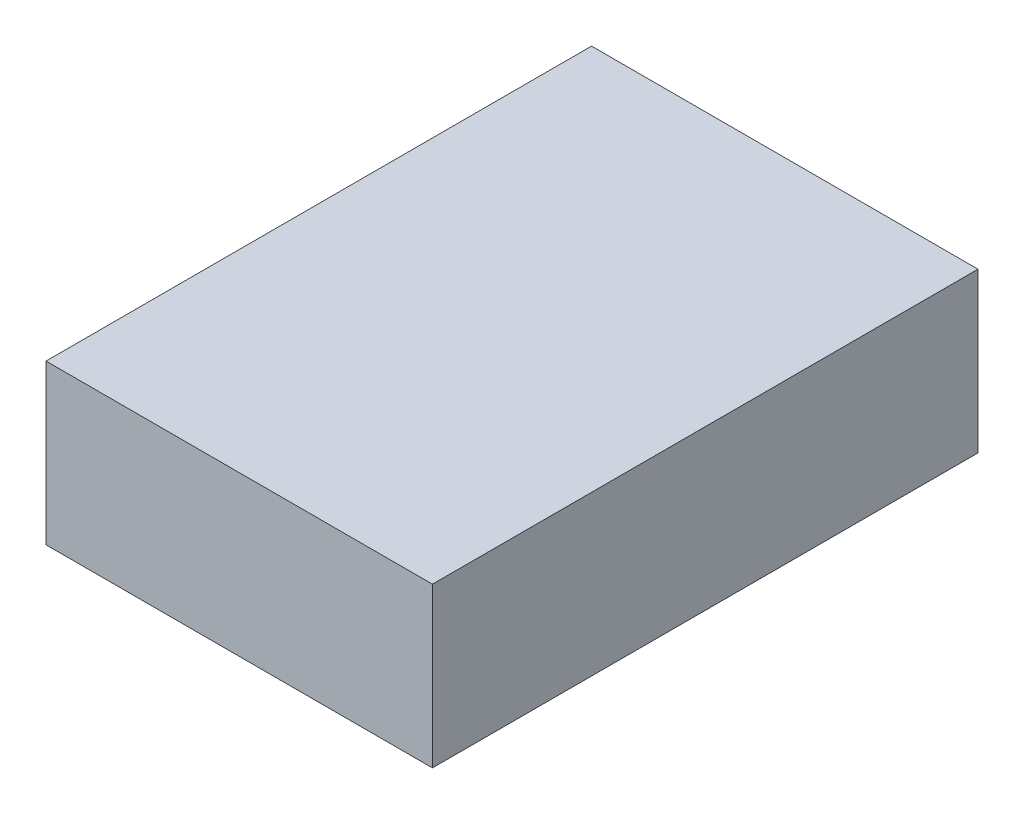
ISO-10303-21;
HEADER;
FILE_DESCRIPTION(('STEP AP214'),'2;1');
FILE_NAME('part.step','',(''),(''),'','','');
FILE_SCHEMA(('AUTOMOTIVE_DESIGN { 1 0 10303 214 1 1 1 1 }'));
ENDSEC;
DATA;
#1=APPLICATION_CONTEXT('core data for automotive mechanical design processes');
#2=APPLICATION_PROTOCOL_DEFINITION('international standard','automotive_design',2000,#1);
#3=PRODUCT_CONTEXT('',#1,'mechanical');
#4=PRODUCT('Part','Part','',(#3));
#5=PRODUCT_RELATED_PRODUCT_CATEGORY('part','',(#4));
#6=PRODUCT_DEFINITION_FORMATION('','',#4);
#7=PRODUCT_DEFINITION_CONTEXT('part definition',#1,'design');
#8=PRODUCT_DEFINITION('design','',#6,#7);
#9=PRODUCT_DEFINITION_SHAPE('','',#8);
#10=(LENGTH_UNIT() NAMED_UNIT(*) SI_UNIT(.MILLI.,.METRE.));
#11=(NAMED_UNIT(*) PLANE_ANGLE_UNIT() SI_UNIT($,.RADIAN.));
#12=(NAMED_UNIT(*) SI_UNIT($,.STERADIAN.) SOLID_ANGLE_UNIT());
#13=UNCERTAINTY_MEASURE_WITH_UNIT(LENGTH_MEASURE(1.E-05),#10,'distance_accuracy_value','');
#14=(GEOMETRIC_REPRESENTATION_CONTEXT(3) GLOBAL_UNCERTAINTY_ASSIGNED_CONTEXT((#13)) GLOBAL_UNIT_ASSIGNED_CONTEXT((#10,
#11,#12)) REPRESENTATION_CONTEXT('',''));
#15=CARTESIAN_POINT('',(0.,0.,0.));
#16=DIRECTION('',(0.,0.,1.));
#17=DIRECTION('',(1.,0.,0.));
#18=AXIS2_PLACEMENT_3D('',#15,#16,#17);
#19=CARTESIAN_POINT('',(17.,14.,-24.));
#20=DIRECTION('',(-1.,0.,0.));
#21=DIRECTION('',(0.,0.,1.));
#22=AXIS2_PLACEMENT_3D('',#19,#20,#21);
#23=PLANE('',#22);
#24=DIRECTION('',(0.,0.,-1.));
#25=VECTOR('',#24,1.);
#26=CARTESIAN_POINT('',(17.,0.,-24.));
#27=LINE('',#26,#25);
#28=CARTESIAN_POINT('',(17.,0.,24.));
#29=VERTEX_POINT('',#28);
#30=CARTESIAN_POINT('',(17.,0.,-24.));
#31=VERTEX_POINT('',#30);
#32=EDGE_CURVE('E100',#29,#31,#27,.T.);
#33=ORIENTED_EDGE('',*,*,#32,.T.);
#34=DIRECTION('',(0.,-1.,0.));
#35=VECTOR('',#34,1.);
#36=CARTESIAN_POINT('',(17.,14.,-24.));
#37=LINE('',#36,#35);
#38=CARTESIAN_POINT('',(17.,14.,-24.));
#39=VERTEX_POINT('',#38);
#40=EDGE_CURVE('E11',#39,#31,#37,.T.);
#41=ORIENTED_EDGE('',*,*,#40,.F.);
#42=DIRECTION('',(0.,0.,-1.));
#43=VECTOR('',#42,1.);
#44=CARTESIAN_POINT('',(17.,14.,-24.));
#45=LINE('',#44,#43);
#46=CARTESIAN_POINT('',(17.,14.,24.));
#47=VERTEX_POINT('',#46);
#48=EDGE_CURVE('E88',#47,#39,#45,.T.);
#49=ORIENTED_EDGE('',*,*,#48,.F.);
#50=DIRECTION('',(0.,-1.,0.));
#51=VECTOR('',#50,1.);
#52=CARTESIAN_POINT('',(17.,14.,24.));
#53=LINE('',#52,#51);
#54=EDGE_CURVE('E96',#47,#29,#53,.T.);
#55=ORIENTED_EDGE('',*,*,#54,.T.);
#56=EDGE_LOOP('',(#33,#41,#49,#55));
#57=FACE_BOUND('',#56,.T.);
#58=ADVANCED_FACE('F37',(#57),#23,.F.);
#59=CARTESIAN_POINT('',(-17.,14.,-24.));
#60=DIRECTION('',(0.,0.,1.));
#61=DIRECTION('',(1.,0.,0.));
#62=AXIS2_PLACEMENT_3D('',#59,#60,#61);
#63=PLANE('',#62);
#64=DIRECTION('',(-1.,0.,0.));
#65=VECTOR('',#64,1.);
#66=CARTESIAN_POINT('',(-17.,0.,-24.));
#67=LINE('',#66,#65);
#68=CARTESIAN_POINT('',(-17.,0.,-24.));
#69=VERTEX_POINT('',#68);
#70=EDGE_CURVE('E92',#31,#69,#67,.T.);
#71=ORIENTED_EDGE('',*,*,#70,.T.);
#72=DIRECTION('',(0.,-1.,0.));
#73=VECTOR('',#72,1.);
#74=CARTESIAN_POINT('',(-17.,14.,-24.));
#75=LINE('',#74,#73);
#76=CARTESIAN_POINT('',(-17.,14.,-24.));
#77=VERTEX_POINT('',#76);
#78=EDGE_CURVE('E45',#77,#69,#75,.T.);
#79=ORIENTED_EDGE('',*,*,#78,.F.);
#80=DIRECTION('',(-1.,0.,0.));
#81=VECTOR('',#80,1.);
#82=CARTESIAN_POINT('',(-17.,14.,-24.));
#83=LINE('',#82,#81);
#84=EDGE_CURVE('E83',#39,#77,#83,.T.);
#85=ORIENTED_EDGE('',*,*,#84,.F.);
#86=ORIENTED_EDGE('',*,*,#40,.T.);
#87=EDGE_LOOP('',(#71,#79,#85,#86));
#88=FACE_BOUND('',#87,.T.);
#89=ADVANCED_FACE('F91',(#88),#63,.F.);
#90=CARTESIAN_POINT('',(-17.,14.,-24.));
#91=DIRECTION('',(1.,0.,0.));
#92=DIRECTION('',(0.,0.,-1.));
#93=AXIS2_PLACEMENT_3D('',#90,#91,#92);
#94=PLANE('',#93);
#95=DIRECTION('',(0.,0.,1.));
#96=VECTOR('',#95,1.);
#97=CARTESIAN_POINT('',(-17.,0.,-24.));
#98=LINE('',#97,#96);
#99=CARTESIAN_POINT('',(-17.,0.,24.));
#100=VERTEX_POINT('',#99);
#101=EDGE_CURVE('E70',#69,#100,#98,.T.);
#102=ORIENTED_EDGE('',*,*,#101,.T.);
#103=DIRECTION('',(0.,-1.,0.));
#104=VECTOR('',#103,1.);
#105=CARTESIAN_POINT('',(-17.,14.,24.));
#106=LINE('',#105,#104);
#107=CARTESIAN_POINT('',(-17.,14.,24.));
#108=VERTEX_POINT('',#107);
#109=EDGE_CURVE('E93',#108,#100,#106,.T.);
#110=ORIENTED_EDGE('',*,*,#109,.F.);
#111=DIRECTION('',(0.,0.,1.));
#112=VECTOR('',#111,1.);
#113=CARTESIAN_POINT('',(-17.,14.,-24.));
#114=LINE('',#113,#112);
#115=EDGE_CURVE('E86',#77,#108,#114,.T.);
#116=ORIENTED_EDGE('',*,*,#115,.F.);
#117=ORIENTED_EDGE('',*,*,#78,.T.);
#118=EDGE_LOOP('',(#102,#110,#116,#117));
#119=FACE_BOUND('',#118,.T.);
#120=ADVANCED_FACE('F94',(#119),#94,.F.);
#121=CARTESIAN_POINT('',(-17.,14.,24.));
#122=DIRECTION('',(0.,0.,-1.));
#123=DIRECTION('',(-1.,0.,0.));
#124=AXIS2_PLACEMENT_3D('',#121,#122,#123);
#125=PLANE('',#124);
#126=DIRECTION('',(1.,0.,0.));
#127=VECTOR('',#126,1.);
#128=CARTESIAN_POINT('',(-17.,0.,24.));
#129=LINE('',#128,#127);
#130=EDGE_CURVE('E76',#100,#29,#129,.T.);
#131=ORIENTED_EDGE('',*,*,#130,.T.);
#132=ORIENTED_EDGE('',*,*,#54,.F.);
#133=DIRECTION('',(1.,0.,0.));
#134=VECTOR('',#133,1.);
#135=CARTESIAN_POINT('',(-17.,14.,24.));
#136=LINE('',#135,#134);
#137=EDGE_CURVE('E53',#108,#47,#136,.T.);
#138=ORIENTED_EDGE('',*,*,#137,.F.);
#139=ORIENTED_EDGE('',*,*,#109,.T.);
#140=EDGE_LOOP('',(#131,#132,#138,#139));
#141=FACE_BOUND('',#140,.T.);
#142=ADVANCED_FACE('F107',(#141),#125,.F.);
#143=CARTESIAN_POINT('',(0.,14.,0.));
#144=DIRECTION('',(0.,1.,0.));
#145=DIRECTION('',(0.,0.,1.));
#146=AXIS2_PLACEMENT_3D('',#143,#144,#145);
#147=PLANE('',#146);
#148=ORIENTED_EDGE('',*,*,#48,.T.);
#149=ORIENTED_EDGE('',*,*,#84,.T.);
#150=ORIENTED_EDGE('',*,*,#115,.T.);
#151=ORIENTED_EDGE('',*,*,#137,.T.);
#152=EDGE_LOOP('',(#148,#149,#150,#151));
#153=FACE_BOUND('',#152,.T.);
#154=ADVANCED_FACE('F84',(#153),#147,.T.);
#155=CARTESIAN_POINT('',(0.,0.,0.));
#156=DIRECTION('',(0.,1.,0.));
#157=DIRECTION('',(0.,0.,1.));
#158=AXIS2_PLACEMENT_3D('',#155,#156,#157);
#159=PLANE('',#158);
#160=ORIENTED_EDGE('',*,*,#32,.F.);
#161=ORIENTED_EDGE('',*,*,#130,.F.);
#162=ORIENTED_EDGE('',*,*,#101,.F.);
#163=ORIENTED_EDGE('',*,*,#70,.F.);
#164=EDGE_LOOP('',(#160,#161,#162,#163));
#165=FACE_BOUND('',#164,.T.);
#166=ADVANCED_FACE('F110',(#165),#159,.F.);
#167=CLOSED_SHELL('',(#58,#89,#120,#142,#154,#166));
#168=MANIFOLD_SOLID_BREP('B2',#167);
#169=ADVANCED_BREP_SHAPE_REPRESENTATION('',(#18,#168),#14);
#170=SHAPE_DEFINITION_REPRESENTATION(#9,#169);
ENDSEC;
END-ISO-10303-21;
